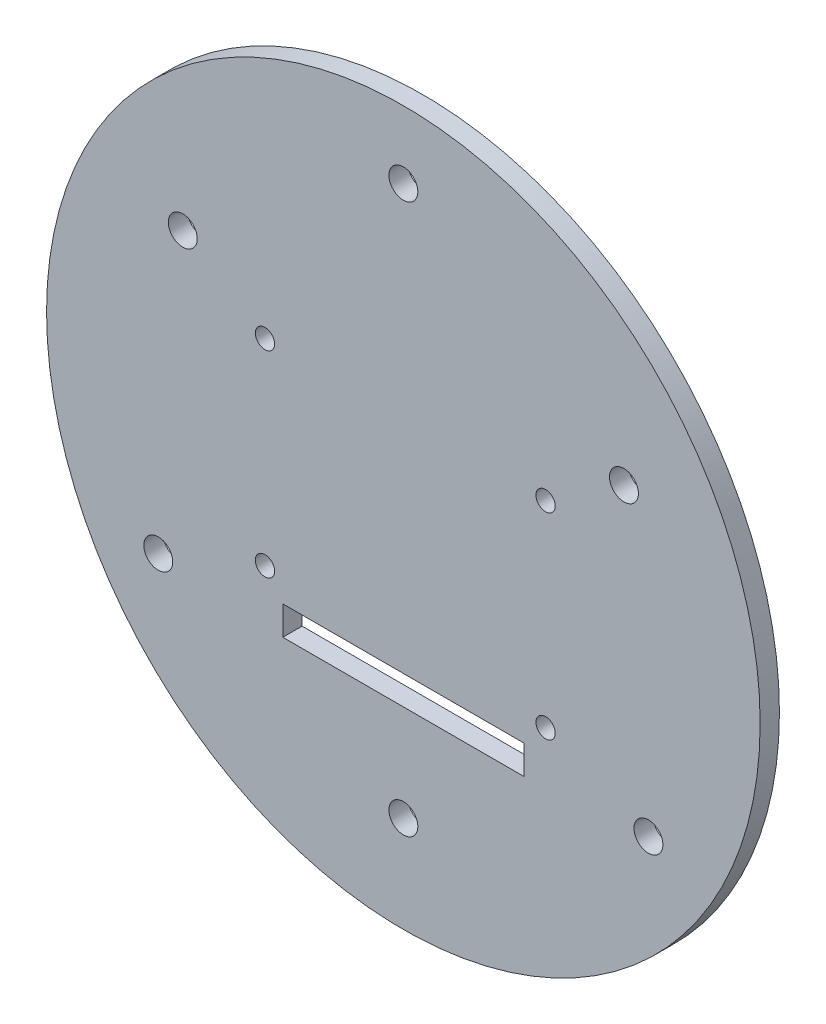
ISO-10303-21;
HEADER;
FILE_DESCRIPTION(('STEP AP214'),'2;1');
FILE_NAME('part.step','',(''),(''),'','','');
FILE_SCHEMA(('AUTOMOTIVE_DESIGN { 1 0 10303 214 1 1 1 1 }'));
ENDSEC;
DATA;
#1=APPLICATION_CONTEXT('core data for automotive mechanical design processes');
#2=APPLICATION_PROTOCOL_DEFINITION('international standard','automotive_design',2000,#1);
#3=PRODUCT_CONTEXT('',#1,'mechanical');
#4=PRODUCT('Part','Part','',(#3));
#5=PRODUCT_RELATED_PRODUCT_CATEGORY('part','',(#4));
#6=PRODUCT_DEFINITION_FORMATION('','',#4);
#7=PRODUCT_DEFINITION_CONTEXT('part definition',#1,'design');
#8=PRODUCT_DEFINITION('design','',#6,#7);
#9=PRODUCT_DEFINITION_SHAPE('','',#8);
#10=(LENGTH_UNIT() NAMED_UNIT(*) SI_UNIT(.MILLI.,.METRE.));
#11=(NAMED_UNIT(*) PLANE_ANGLE_UNIT() SI_UNIT($,.RADIAN.));
#12=(NAMED_UNIT(*) SI_UNIT($,.STERADIAN.) SOLID_ANGLE_UNIT());
#13=UNCERTAINTY_MEASURE_WITH_UNIT(LENGTH_MEASURE(1.E-05),#10,'distance_accuracy_value','');
#14=(GEOMETRIC_REPRESENTATION_CONTEXT(3) GLOBAL_UNCERTAINTY_ASSIGNED_CONTEXT((#13)) GLOBAL_UNIT_ASSIGNED_CONTEXT((#10,
#11,#12)) REPRESENTATION_CONTEXT('',''));
#15=CARTESIAN_POINT('',(0.,0.,0.));
#16=DIRECTION('',(0.,0.,1.));
#17=DIRECTION('',(1.,0.,0.));
#18=AXIS2_PLACEMENT_3D('',#15,#16,#17);
#19=CARTESIAN_POINT('',(0.,0.,2.));
#20=DIRECTION('',(0.,0.,1.));
#21=DIRECTION('',(1.,0.,0.));
#22=AXIS2_PLACEMENT_3D('',#19,#20,#21);
#23=PLANE('',#22);
#24=CARTESIAN_POINT('',(14.75,8.9,2.));
#25=DIRECTION('',(0.,0.,1.));
#26=DIRECTION('',(1.,0.,0.));
#27=AXIS2_PLACEMENT_3D('',#24,#25,#26);
#28=CIRCLE('',#27,1.);
#29=CARTESIAN_POINT('',(15.75,8.9,2.));
#30=VERTEX_POINT('',#29);
#31=EDGE_CURVE('E206',#30,#30,#28,.T.);
#32=ORIENTED_EDGE('',*,*,#31,.F.);
#33=EDGE_LOOP('',(#32));
#34=FACE_BOUND('',#33,.T.);
#35=CARTESIAN_POINT('',(14.75,-11.5,2.));
#36=DIRECTION('',(0.,0.,1.));
#37=DIRECTION('',(1.,0.,0.));
#38=AXIS2_PLACEMENT_3D('',#35,#36,#37);
#39=CIRCLE('',#38,1.);
#40=CARTESIAN_POINT('',(15.75,-11.5,2.));
#41=VERTEX_POINT('',#40);
#42=EDGE_CURVE('E211',#41,#41,#39,.T.);
#43=ORIENTED_EDGE('',*,*,#42,.F.);
#44=EDGE_LOOP('',(#43));
#45=FACE_BOUND('',#44,.T.);
#46=CARTESIAN_POINT('',(-14.35,-11.5,2.));
#47=DIRECTION('',(0.,0.,1.));
#48=DIRECTION('',(1.,0.,0.));
#49=AXIS2_PLACEMENT_3D('',#46,#47,#48);
#50=CIRCLE('',#49,1.);
#51=CARTESIAN_POINT('',(-13.35,-11.5,2.));
#52=VERTEX_POINT('',#51);
#53=EDGE_CURVE('E216',#52,#52,#50,.T.);
#54=ORIENTED_EDGE('',*,*,#53,.F.);
#55=EDGE_LOOP('',(#54));
#56=FACE_BOUND('',#55,.T.);
#57=CARTESIAN_POINT('',(-14.35,8.9,2.));
#58=DIRECTION('',(0.,0.,1.));
#59=DIRECTION('',(1.,0.,0.));
#60=AXIS2_PLACEMENT_3D('',#57,#58,#59);
#61=CIRCLE('',#60,1.);
#62=CARTESIAN_POINT('',(-13.35,8.9,2.));
#63=VERTEX_POINT('',#62);
#64=EDGE_CURVE('E118',#63,#63,#61,.T.);
#65=ORIENTED_EDGE('',*,*,#64,.F.);
#66=EDGE_LOOP('',(#65));
#67=FACE_BOUND('',#66,.T.);
#68=CARTESIAN_POINT('',(25.4164532094862,-15.9375,2.));
#69=DIRECTION('',(0.,0.,1.));
#70=DIRECTION('',(1.,0.,0.));
#71=AXIS2_PLACEMENT_3D('',#68,#69,#70);
#72=CIRCLE('',#71,1.5);
#73=CARTESIAN_POINT('',(26.9164532094862,-15.9375,2.));
#74=VERTEX_POINT('',#73);
#75=EDGE_CURVE('E142',#74,#74,#72,.T.);
#76=ORIENTED_EDGE('',*,*,#75,.F.);
#77=EDGE_LOOP('',(#76));
#78=FACE_BOUND('',#77,.T.);
#79=CARTESIAN_POINT('',(-25.4164532094862,-15.9375,2.));
#80=DIRECTION('',(0.,0.,1.));
#81=DIRECTION('',(1.,0.,0.));
#82=AXIS2_PLACEMENT_3D('',#79,#80,#81);
#83=CIRCLE('',#82,1.5);
#84=CARTESIAN_POINT('',(-23.9164532094862,-15.9375,2.));
#85=VERTEX_POINT('',#84);
#86=EDGE_CURVE('E158',#85,#85,#83,.T.);
#87=ORIENTED_EDGE('',*,*,#86,.F.);
#88=EDGE_LOOP('',(#87));
#89=FACE_BOUND('',#88,.T.);
#90=CARTESIAN_POINT('',(0.,30.,2.));
#91=DIRECTION('',(0.,0.,1.));
#92=DIRECTION('',(1.,0.,0.));
#93=AXIS2_PLACEMENT_3D('',#90,#91,#92);
#94=CIRCLE('',#93,1.5);
#95=CARTESIAN_POINT('',(1.5,30.,2.));
#96=VERTEX_POINT('',#95);
#97=EDGE_CURVE('E174',#96,#96,#94,.T.);
#98=ORIENTED_EDGE('',*,*,#97,.F.);
#99=EDGE_LOOP('',(#98));
#100=FACE_BOUND('',#99,.T.);
#101=CARTESIAN_POINT('',(0.,0.,2.));
#102=DIRECTION('',(0.,0.,1.));
#103=DIRECTION('',(1.,0.,0.));
#104=AXIS2_PLACEMENT_3D('',#101,#102,#103);
#105=CIRCLE('',#104,37.);
#106=CARTESIAN_POINT('',(37.,0.,2.));
#107=VERTEX_POINT('',#106);
#108=EDGE_CURVE('E11',#107,#107,#105,.T.);
#109=ORIENTED_EDGE('',*,*,#108,.T.);
#110=EDGE_LOOP('',(#109));
#111=FACE_BOUND('',#110,.T.);
#112=CARTESIAN_POINT('',(-22.8748078885376,14.34375,2.));
#113=DIRECTION('',(0.,0.,1.));
#114=DIRECTION('',(1.,0.,0.));
#115=AXIS2_PLACEMENT_3D('',#112,#113,#114);
#116=CIRCLE('',#115,1.5);
#117=CARTESIAN_POINT('',(-21.3748078885376,14.34375,2.));
#118=VERTEX_POINT('',#117);
#119=EDGE_CURVE('E166',#118,#118,#116,.T.);
#120=ORIENTED_EDGE('',*,*,#119,.F.);
#121=EDGE_LOOP('',(#120));
#122=FACE_BOUND('',#121,.T.);
#123=CARTESIAN_POINT('',(0.,-27.,2.));
#124=DIRECTION('',(0.,0.,1.));
#125=DIRECTION('',(1.,0.,0.));
#126=AXIS2_PLACEMENT_3D('',#123,#124,#125);
#127=CIRCLE('',#126,1.5);
#128=CARTESIAN_POINT('',(1.5,-27.,2.));
#129=VERTEX_POINT('',#128);
#130=EDGE_CURVE('E150',#129,#129,#127,.T.);
#131=ORIENTED_EDGE('',*,*,#130,.F.);
#132=EDGE_LOOP('',(#131));
#133=FACE_BOUND('',#132,.T.);
#134=CARTESIAN_POINT('',(22.8748078885376,14.34375,2.));
#135=DIRECTION('',(0.,0.,1.));
#136=DIRECTION('',(1.,0.,0.));
#137=AXIS2_PLACEMENT_3D('',#134,#135,#136);
#138=CIRCLE('',#137,1.5);
#139=CARTESIAN_POINT('',(24.3748078885376,14.34375,2.));
#140=VERTEX_POINT('',#139);
#141=EDGE_CURVE('E134',#140,#140,#138,.T.);
#142=ORIENTED_EDGE('',*,*,#141,.F.);
#143=EDGE_LOOP('',(#142));
#144=FACE_BOUND('',#143,.T.);
#145=DIRECTION('',(-1.,0.,0.));
#146=VECTOR('',#145,1.);
#147=CARTESIAN_POINT('',(12.5,-14.,2.));
#148=LINE('',#147,#146);
#149=CARTESIAN_POINT('',(12.5,-14.,2.));
#150=VERTEX_POINT('',#149);
#151=CARTESIAN_POINT('',(-12.5,-14.,2.));
#152=VERTEX_POINT('',#151);
#153=EDGE_CURVE('E93',#150,#152,#148,.T.);
#154=ORIENTED_EDGE('',*,*,#153,.F.);
#155=DIRECTION('',(0.,1.,0.));
#156=VECTOR('',#155,1.);
#157=CARTESIAN_POINT('',(12.5,-14.,2.));
#158=LINE('',#157,#156);
#159=CARTESIAN_POINT('',(12.5,-17.,2.));
#160=VERTEX_POINT('',#159);
#161=EDGE_CURVE('E84',#160,#150,#158,.T.);
#162=ORIENTED_EDGE('',*,*,#161,.F.);
#163=DIRECTION('',(1.,0.,0.));
#164=VECTOR('',#163,1.);
#165=CARTESIAN_POINT('',(12.5,-17.,2.));
#166=LINE('',#165,#164);
#167=CARTESIAN_POINT('',(-12.5,-17.,2.));
#168=VERTEX_POINT('',#167);
#169=EDGE_CURVE('E110',#168,#160,#166,.T.);
#170=ORIENTED_EDGE('',*,*,#169,.F.);
#171=DIRECTION('',(0.,-1.,0.));
#172=VECTOR('',#171,1.);
#173=CARTESIAN_POINT('',(-12.5,-14.,2.));
#174=LINE('',#173,#172);
#175=EDGE_CURVE('E106',#152,#168,#174,.T.);
#176=ORIENTED_EDGE('',*,*,#175,.F.);
#177=EDGE_LOOP('',(#154,#162,#170,#176));
#178=FACE_BOUND('',#177,.T.);
#179=ADVANCED_FACE('F40',(#34,#45,#56,#67,#78,#89,#100,#111,#122,#133,#144,#178),#23,.T.);
#180=CARTESIAN_POINT('',(0.,0.,0.));
#181=DIRECTION('',(0.,0.,1.));
#182=DIRECTION('',(1.,0.,0.));
#183=AXIS2_PLACEMENT_3D('',#180,#181,#182);
#184=PLANE('',#183);
#185=CARTESIAN_POINT('',(22.8748078885376,14.34375,0.));
#186=DIRECTION('',(0.,0.,1.));
#187=DIRECTION('',(1.,0.,0.));
#188=AXIS2_PLACEMENT_3D('',#185,#186,#187);
#189=CIRCLE('',#188,1.5);
#190=CARTESIAN_POINT('',(24.3748078885376,14.34375,0.));
#191=VERTEX_POINT('',#190);
#192=EDGE_CURVE('E102',#191,#191,#189,.T.);
#193=ORIENTED_EDGE('',*,*,#192,.T.);
#194=EDGE_LOOP('',(#193));
#195=FACE_BOUND('',#194,.T.);
#196=CARTESIAN_POINT('',(25.4164532094862,-15.9375,0.));
#197=DIRECTION('',(0.,0.,1.));
#198=DIRECTION('',(1.,0.,0.));
#199=AXIS2_PLACEMENT_3D('',#196,#197,#198);
#200=CIRCLE('',#199,1.5);
#201=CARTESIAN_POINT('',(26.9164532094862,-15.9375,0.));
#202=VERTEX_POINT('',#201);
#203=EDGE_CURVE('E138',#202,#202,#200,.T.);
#204=ORIENTED_EDGE('',*,*,#203,.T.);
#205=EDGE_LOOP('',(#204));
#206=FACE_BOUND('',#205,.T.);
#207=CARTESIAN_POINT('',(0.,-27.,0.));
#208=DIRECTION('',(0.,0.,1.));
#209=DIRECTION('',(1.,0.,0.));
#210=AXIS2_PLACEMENT_3D('',#207,#208,#209);
#211=CIRCLE('',#210,1.5);
#212=CARTESIAN_POINT('',(1.5,-27.,0.));
#213=VERTEX_POINT('',#212);
#214=EDGE_CURVE('E146',#213,#213,#211,.T.);
#215=ORIENTED_EDGE('',*,*,#214,.T.);
#216=EDGE_LOOP('',(#215));
#217=FACE_BOUND('',#216,.T.);
#218=CARTESIAN_POINT('',(-25.4164532094862,-15.9375,0.));
#219=DIRECTION('',(0.,0.,1.));
#220=DIRECTION('',(1.,0.,0.));
#221=AXIS2_PLACEMENT_3D('',#218,#219,#220);
#222=CIRCLE('',#221,1.5);
#223=CARTESIAN_POINT('',(-23.9164532094862,-15.9375,0.));
#224=VERTEX_POINT('',#223);
#225=EDGE_CURVE('E154',#224,#224,#222,.T.);
#226=ORIENTED_EDGE('',*,*,#225,.T.);
#227=EDGE_LOOP('',(#226));
#228=FACE_BOUND('',#227,.T.);
#229=CARTESIAN_POINT('',(-22.8748078885376,14.34375,0.));
#230=DIRECTION('',(0.,0.,1.));
#231=DIRECTION('',(1.,0.,0.));
#232=AXIS2_PLACEMENT_3D('',#229,#230,#231);
#233=CIRCLE('',#232,1.5);
#234=CARTESIAN_POINT('',(-21.3748078885376,14.34375,0.));
#235=VERTEX_POINT('',#234);
#236=EDGE_CURVE('E162',#235,#235,#233,.T.);
#237=ORIENTED_EDGE('',*,*,#236,.T.);
#238=EDGE_LOOP('',(#237));
#239=FACE_BOUND('',#238,.T.);
#240=CARTESIAN_POINT('',(0.,30.,0.));
#241=DIRECTION('',(0.,0.,1.));
#242=DIRECTION('',(1.,0.,0.));
#243=AXIS2_PLACEMENT_3D('',#240,#241,#242);
#244=CIRCLE('',#243,1.5);
#245=CARTESIAN_POINT('',(1.5,30.,0.));
#246=VERTEX_POINT('',#245);
#247=EDGE_CURVE('E170',#246,#246,#244,.T.);
#248=ORIENTED_EDGE('',*,*,#247,.T.);
#249=EDGE_LOOP('',(#248));
#250=FACE_BOUND('',#249,.T.);
#251=CARTESIAN_POINT('',(0.,0.,0.));
#252=DIRECTION('',(0.,0.,1.));
#253=DIRECTION('',(1.,0.,0.));
#254=AXIS2_PLACEMENT_3D('',#251,#252,#253);
#255=CIRCLE('',#254,37.);
#256=CARTESIAN_POINT('',(37.,0.,0.));
#257=VERTEX_POINT('',#256);
#258=EDGE_CURVE('E50',#257,#257,#255,.T.);
#259=ORIENTED_EDGE('',*,*,#258,.F.);
#260=EDGE_LOOP('',(#259));
#261=FACE_BOUND('',#260,.T.);
#262=DIRECTION('',(0.,1.,0.));
#263=VECTOR('',#262,1.);
#264=CARTESIAN_POINT('',(12.5,-14.,0.));
#265=LINE('',#264,#263);
#266=CARTESIAN_POINT('',(12.5,-17.,0.));
#267=VERTEX_POINT('',#266);
#268=CARTESIAN_POINT('',(12.5,-14.,0.));
#269=VERTEX_POINT('',#268);
#270=EDGE_CURVE('E66',#267,#269,#265,.T.);
#271=ORIENTED_EDGE('',*,*,#270,.T.);
#272=DIRECTION('',(-1.,0.,0.));
#273=VECTOR('',#272,1.);
#274=CARTESIAN_POINT('',(12.5,-14.,0.));
#275=LINE('',#274,#273);
#276=CARTESIAN_POINT('',(-12.5,-14.,0.));
#277=VERTEX_POINT('',#276);
#278=EDGE_CURVE('E100',#269,#277,#275,.T.);
#279=ORIENTED_EDGE('',*,*,#278,.T.);
#280=DIRECTION('',(0.,-1.,0.));
#281=VECTOR('',#280,1.);
#282=CARTESIAN_POINT('',(-12.5,-14.,0.));
#283=LINE('',#282,#281);
#284=CARTESIAN_POINT('',(-12.5,-17.,0.));
#285=VERTEX_POINT('',#284);
#286=EDGE_CURVE('E121',#277,#285,#283,.T.);
#287=ORIENTED_EDGE('',*,*,#286,.T.);
#288=DIRECTION('',(1.,0.,0.));
#289=VECTOR('',#288,1.);
#290=CARTESIAN_POINT('',(12.5,-17.,0.));
#291=LINE('',#290,#289);
#292=EDGE_CURVE('E94',#285,#267,#291,.T.);
#293=ORIENTED_EDGE('',*,*,#292,.T.);
#294=EDGE_LOOP('',(#271,#279,#287,#293));
#295=FACE_BOUND('',#294,.T.);
#296=CARTESIAN_POINT('',(-14.35,-11.5,0.));
#297=DIRECTION('',(0.,0.,1.));
#298=DIRECTION('',(1.,0.,0.));
#299=AXIS2_PLACEMENT_3D('',#296,#297,#298);
#300=CIRCLE('',#299,1.);
#301=CARTESIAN_POINT('',(-13.35,-11.5,0.));
#302=VERTEX_POINT('',#301);
#303=EDGE_CURVE('E193',#302,#302,#300,.F.);
#304=ORIENTED_EDGE('',*,*,#303,.F.);
#305=EDGE_LOOP('',(#304));
#306=FACE_BOUND('',#305,.T.);
#307=CARTESIAN_POINT('',(14.75,8.9,0.));
#308=DIRECTION('',(0.,0.,1.));
#309=DIRECTION('',(1.,0.,0.));
#310=AXIS2_PLACEMENT_3D('',#307,#308,#309);
#311=CIRCLE('',#310,1.);
#312=CARTESIAN_POINT('',(15.75,8.9,0.));
#313=VERTEX_POINT('',#312);
#314=EDGE_CURVE('E44',#313,#313,#311,.F.);
#315=ORIENTED_EDGE('',*,*,#314,.F.);
#316=EDGE_LOOP('',(#315));
#317=FACE_BOUND('',#316,.T.);
#318=CARTESIAN_POINT('',(14.75,-11.5,0.));
#319=DIRECTION('',(0.,0.,1.));
#320=DIRECTION('',(1.,0.,0.));
#321=AXIS2_PLACEMENT_3D('',#318,#319,#320);
#322=CIRCLE('',#321,1.);
#323=CARTESIAN_POINT('',(15.75,-11.5,0.));
#324=VERTEX_POINT('',#323);
#325=EDGE_CURVE('E200',#324,#324,#322,.F.);
#326=ORIENTED_EDGE('',*,*,#325,.F.);
#327=EDGE_LOOP('',(#326));
#328=FACE_BOUND('',#327,.T.);
#329=CARTESIAN_POINT('',(-14.35,8.9,0.));
#330=DIRECTION('',(0.,0.,1.));
#331=DIRECTION('',(1.,0.,0.));
#332=AXIS2_PLACEMENT_3D('',#329,#330,#331);
#333=CIRCLE('',#332,1.);
#334=CARTESIAN_POINT('',(-13.35,8.9,0.));
#335=VERTEX_POINT('',#334);
#336=EDGE_CURVE('E203',#335,#335,#333,.F.);
#337=ORIENTED_EDGE('',*,*,#336,.F.);
#338=EDGE_LOOP('',(#337));
#339=FACE_BOUND('',#338,.T.);
#340=ADVANCED_FACE('F185',(#195,#206,#217,#228,#239,#250,#261,#295,#306,#317,#328,#339),#184,.F.);
#341=CARTESIAN_POINT('',(0.,0.,2.));
#342=DIRECTION('',(0.,0.,-1.));
#343=DIRECTION('',(-1.,0.,0.));
#344=AXIS2_PLACEMENT_3D('',#341,#342,#343);
#345=CYLINDRICAL_SURFACE('',#344,37.);
#346=ORIENTED_EDGE('',*,*,#108,.F.);
#347=EDGE_LOOP('',(#346));
#348=FACE_BOUND('',#347,.T.);
#349=ORIENTED_EDGE('',*,*,#258,.T.);
#350=EDGE_LOOP('',(#349));
#351=FACE_BOUND('',#350,.T.);
#352=ADVANCED_FACE('F42',(#348,#351),#345,.T.);
#353=CARTESIAN_POINT('',(0.,30.,2.));
#354=DIRECTION('',(0.,0.,-1.));
#355=DIRECTION('',(-1.,0.,0.));
#356=AXIS2_PLACEMENT_3D('',#353,#354,#355);
#357=CYLINDRICAL_SURFACE('',#356,1.5);
#358=ORIENTED_EDGE('',*,*,#97,.T.);
#359=EDGE_LOOP('',(#358));
#360=FACE_BOUND('',#359,.T.);
#361=ORIENTED_EDGE('',*,*,#247,.F.);
#362=EDGE_LOOP('',(#361));
#363=FACE_BOUND('',#362,.T.);
#364=ADVANCED_FACE('F263',(#360,#363),#357,.F.);
#365=CARTESIAN_POINT('',(-22.8748078885376,14.34375,2.));
#366=DIRECTION('',(0.,0.,-1.));
#367=DIRECTION('',(-1.,0.,0.));
#368=AXIS2_PLACEMENT_3D('',#365,#366,#367);
#369=CYLINDRICAL_SURFACE('',#368,1.5);
#370=ORIENTED_EDGE('',*,*,#119,.T.);
#371=EDGE_LOOP('',(#370));
#372=FACE_BOUND('',#371,.T.);
#373=ORIENTED_EDGE('',*,*,#236,.F.);
#374=EDGE_LOOP('',(#373));
#375=FACE_BOUND('',#374,.T.);
#376=ADVANCED_FACE('F265',(#372,#375),#369,.F.);
#377=CARTESIAN_POINT('',(-25.4164532094862,-15.9375,2.));
#378=DIRECTION('',(0.,0.,-1.));
#379=DIRECTION('',(-1.,0.,0.));
#380=AXIS2_PLACEMENT_3D('',#377,#378,#379);
#381=CYLINDRICAL_SURFACE('',#380,1.5);
#382=ORIENTED_EDGE('',*,*,#86,.T.);
#383=EDGE_LOOP('',(#382));
#384=FACE_BOUND('',#383,.T.);
#385=ORIENTED_EDGE('',*,*,#225,.F.);
#386=EDGE_LOOP('',(#385));
#387=FACE_BOUND('',#386,.T.);
#388=ADVANCED_FACE('F272',(#384,#387),#381,.F.);
#389=CARTESIAN_POINT('',(0.,-27.,2.));
#390=DIRECTION('',(0.,0.,-1.));
#391=DIRECTION('',(-1.,0.,0.));
#392=AXIS2_PLACEMENT_3D('',#389,#390,#391);
#393=CYLINDRICAL_SURFACE('',#392,1.5);
#394=ORIENTED_EDGE('',*,*,#130,.T.);
#395=EDGE_LOOP('',(#394));
#396=FACE_BOUND('',#395,.T.);
#397=ORIENTED_EDGE('',*,*,#214,.F.);
#398=EDGE_LOOP('',(#397));
#399=FACE_BOUND('',#398,.T.);
#400=ADVANCED_FACE('F279',(#396,#399),#393,.F.);
#401=CARTESIAN_POINT('',(25.4164532094862,-15.9375,2.));
#402=DIRECTION('',(0.,0.,-1.));
#403=DIRECTION('',(-1.,0.,0.));
#404=AXIS2_PLACEMENT_3D('',#401,#402,#403);
#405=CYLINDRICAL_SURFACE('',#404,1.5);
#406=ORIENTED_EDGE('',*,*,#75,.T.);
#407=EDGE_LOOP('',(#406));
#408=FACE_BOUND('',#407,.T.);
#409=ORIENTED_EDGE('',*,*,#203,.F.);
#410=EDGE_LOOP('',(#409));
#411=FACE_BOUND('',#410,.T.);
#412=ADVANCED_FACE('F249',(#408,#411),#405,.F.);
#413=CARTESIAN_POINT('',(22.8748078885376,14.34375,2.));
#414=DIRECTION('',(0.,0.,-1.));
#415=DIRECTION('',(-1.,0.,0.));
#416=AXIS2_PLACEMENT_3D('',#413,#414,#415);
#417=CYLINDRICAL_SURFACE('',#416,1.5);
#418=ORIENTED_EDGE('',*,*,#141,.T.);
#419=EDGE_LOOP('',(#418));
#420=FACE_BOUND('',#419,.T.);
#421=ORIENTED_EDGE('',*,*,#192,.F.);
#422=EDGE_LOOP('',(#421));
#423=FACE_BOUND('',#422,.T.);
#424=ADVANCED_FACE('F246',(#420,#423),#417,.F.);
#425=CARTESIAN_POINT('',(12.5,-14.,2.));
#426=DIRECTION('',(-1.,0.,0.));
#427=DIRECTION('',(0.,0.,1.));
#428=AXIS2_PLACEMENT_3D('',#425,#426,#427);
#429=PLANE('',#428);
#430=ORIENTED_EDGE('',*,*,#270,.F.);
#431=DIRECTION('',(0.,0.,-1.));
#432=VECTOR('',#431,1.);
#433=CARTESIAN_POINT('',(12.5,-17.,2.));
#434=LINE('',#433,#432);
#435=EDGE_CURVE('E88',#160,#267,#434,.T.);
#436=ORIENTED_EDGE('',*,*,#435,.F.);
#437=ORIENTED_EDGE('',*,*,#161,.T.);
#438=DIRECTION('',(0.,0.,-1.));
#439=VECTOR('',#438,1.);
#440=CARTESIAN_POINT('',(12.5,-14.,2.));
#441=LINE('',#440,#439);
#442=EDGE_CURVE('E87',#150,#269,#441,.T.);
#443=ORIENTED_EDGE('',*,*,#442,.T.);
#444=EDGE_LOOP('',(#430,#436,#437,#443));
#445=FACE_BOUND('',#444,.T.);
#446=ADVANCED_FACE('F86',(#445),#429,.T.);
#447=CARTESIAN_POINT('',(12.5,-14.,2.));
#448=DIRECTION('',(0.,-1.,0.));
#449=DIRECTION('',(1.,0.,0.));
#450=AXIS2_PLACEMENT_3D('',#447,#448,#449);
#451=PLANE('',#450);
#452=ORIENTED_EDGE('',*,*,#278,.F.);
#453=ORIENTED_EDGE('',*,*,#442,.F.);
#454=ORIENTED_EDGE('',*,*,#153,.T.);
#455=DIRECTION('',(0.,0.,-1.));
#456=VECTOR('',#455,1.);
#457=CARTESIAN_POINT('',(-12.5,-14.,2.));
#458=LINE('',#457,#456);
#459=EDGE_CURVE('E103',#152,#277,#458,.T.);
#460=ORIENTED_EDGE('',*,*,#459,.T.);
#461=EDGE_LOOP('',(#452,#453,#454,#460));
#462=FACE_BOUND('',#461,.T.);
#463=ADVANCED_FACE('F97',(#462),#451,.T.);
#464=CARTESIAN_POINT('',(-12.5,-14.,2.));
#465=DIRECTION('',(1.,0.,0.));
#466=DIRECTION('',(0.,0.,-1.));
#467=AXIS2_PLACEMENT_3D('',#464,#465,#466);
#468=PLANE('',#467);
#469=ORIENTED_EDGE('',*,*,#286,.F.);
#470=ORIENTED_EDGE('',*,*,#459,.F.);
#471=ORIENTED_EDGE('',*,*,#175,.T.);
#472=DIRECTION('',(0.,0.,-1.));
#473=VECTOR('',#472,1.);
#474=CARTESIAN_POINT('',(-12.5,-17.,2.));
#475=LINE('',#474,#473);
#476=EDGE_CURVE('E58',#168,#285,#475,.T.);
#477=ORIENTED_EDGE('',*,*,#476,.T.);
#478=EDGE_LOOP('',(#469,#470,#471,#477));
#479=FACE_BOUND('',#478,.T.);
#480=ADVANCED_FACE('F291',(#479),#468,.T.);
#481=CARTESIAN_POINT('',(12.5,-17.,2.));
#482=DIRECTION('',(0.,1.,0.));
#483=DIRECTION('',(-1.,0.,0.));
#484=AXIS2_PLACEMENT_3D('',#481,#482,#483);
#485=PLANE('',#484);
#486=ORIENTED_EDGE('',*,*,#292,.F.);
#487=ORIENTED_EDGE('',*,*,#476,.F.);
#488=ORIENTED_EDGE('',*,*,#169,.T.);
#489=ORIENTED_EDGE('',*,*,#435,.T.);
#490=EDGE_LOOP('',(#486,#487,#488,#489));
#491=FACE_BOUND('',#490,.T.);
#492=ADVANCED_FACE('F294',(#491),#485,.T.);
#493=CARTESIAN_POINT('',(-14.35,8.9,-17.));
#494=DIRECTION('',(0.,0.,1.));
#495=DIRECTION('',(1.,0.,0.));
#496=AXIS2_PLACEMENT_3D('',#493,#494,#495);
#497=CYLINDRICAL_SURFACE('',#496,1.);
#498=ORIENTED_EDGE('',*,*,#336,.T.);
#499=EDGE_LOOP('',(#498));
#500=FACE_BOUND('',#499,.T.);
#501=ORIENTED_EDGE('',*,*,#64,.T.);
#502=EDGE_LOOP('',(#501));
#503=FACE_BOUND('',#502,.T.);
#504=ADVANCED_FACE('F226',(#500,#503),#497,.F.);
#505=CARTESIAN_POINT('',(-14.35,-11.5,-17.));
#506=DIRECTION('',(0.,0.,1.));
#507=DIRECTION('',(1.,0.,0.));
#508=AXIS2_PLACEMENT_3D('',#505,#506,#507);
#509=CYLINDRICAL_SURFACE('',#508,1.);
#510=ORIENTED_EDGE('',*,*,#303,.T.);
#511=EDGE_LOOP('',(#510));
#512=FACE_BOUND('',#511,.T.);
#513=ORIENTED_EDGE('',*,*,#53,.T.);
#514=EDGE_LOOP('',(#513));
#515=FACE_BOUND('',#514,.T.);
#516=ADVANCED_FACE('F300',(#512,#515),#509,.F.);
#517=CARTESIAN_POINT('',(14.75,-11.5,-17.));
#518=DIRECTION('',(0.,0.,1.));
#519=DIRECTION('',(1.,0.,0.));
#520=AXIS2_PLACEMENT_3D('',#517,#518,#519);
#521=CYLINDRICAL_SURFACE('',#520,1.);
#522=ORIENTED_EDGE('',*,*,#325,.T.);
#523=EDGE_LOOP('',(#522));
#524=FACE_BOUND('',#523,.T.);
#525=ORIENTED_EDGE('',*,*,#42,.T.);
#526=EDGE_LOOP('',(#525));
#527=FACE_BOUND('',#526,.T.);
#528=ADVANCED_FACE('F304',(#524,#527),#521,.F.);
#529=CARTESIAN_POINT('',(14.75,8.9,-17.));
#530=DIRECTION('',(0.,0.,1.));
#531=DIRECTION('',(1.,0.,0.));
#532=AXIS2_PLACEMENT_3D('',#529,#530,#531);
#533=CYLINDRICAL_SURFACE('',#532,1.);
#534=ORIENTED_EDGE('',*,*,#314,.T.);
#535=EDGE_LOOP('',(#534));
#536=FACE_BOUND('',#535,.T.);
#537=ORIENTED_EDGE('',*,*,#31,.T.);
#538=EDGE_LOOP('',(#537));
#539=FACE_BOUND('',#538,.T.);
#540=ADVANCED_FACE('F301',(#536,#539),#533,.F.);
#541=CLOSED_SHELL('',(#179,#340,#352,#364,#376,#388,#400,#412,#424,#446,#463,#480,#492,#504,
#516,#528,#540));
#542=MANIFOLD_SOLID_BREP('B2',#541);
#543=ADVANCED_BREP_SHAPE_REPRESENTATION('',(#18,#542),#14);
#544=SHAPE_DEFINITION_REPRESENTATION(#9,#543);
ENDSEC;
END-ISO-10303-21;
